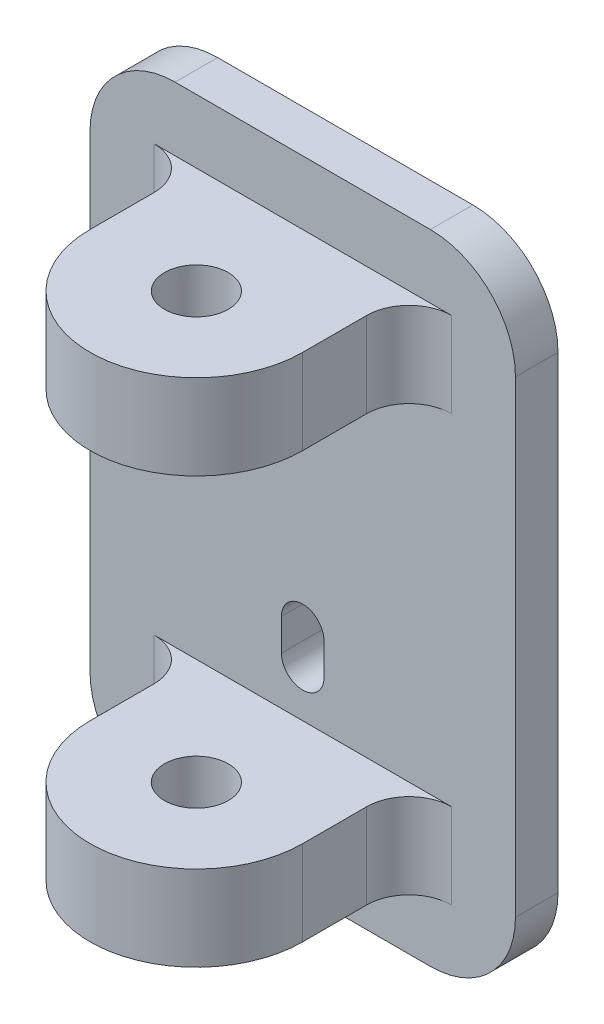
ISO-10303-21;
HEADER;
FILE_DESCRIPTION(('STEP AP214'),'2;1');
FILE_NAME('part.step','',(''),(''),'','','');
FILE_SCHEMA(('AUTOMOTIVE_DESIGN { 1 0 10303 214 1 1 1 1 }'));
ENDSEC;
DATA;
#1=APPLICATION_CONTEXT('core data for automotive mechanical design processes');
#2=APPLICATION_PROTOCOL_DEFINITION('international standard','automotive_design',2000,#1);
#3=PRODUCT_CONTEXT('',#1,'mechanical');
#4=PRODUCT('Part','Part','',(#3));
#5=PRODUCT_RELATED_PRODUCT_CATEGORY('part','',(#4));
#6=PRODUCT_DEFINITION_FORMATION('','',#4);
#7=PRODUCT_DEFINITION_CONTEXT('part definition',#1,'design');
#8=PRODUCT_DEFINITION('design','',#6,#7);
#9=PRODUCT_DEFINITION_SHAPE('','',#8);
#10=(LENGTH_UNIT() NAMED_UNIT(*) SI_UNIT(.MILLI.,.METRE.));
#11=(NAMED_UNIT(*) PLANE_ANGLE_UNIT() SI_UNIT($,.RADIAN.));
#12=(NAMED_UNIT(*) SI_UNIT($,.STERADIAN.) SOLID_ANGLE_UNIT());
#13=UNCERTAINTY_MEASURE_WITH_UNIT(LENGTH_MEASURE(1.E-05),#10,'distance_accuracy_value','');
#14=(GEOMETRIC_REPRESENTATION_CONTEXT(3) GLOBAL_UNCERTAINTY_ASSIGNED_CONTEXT((#13)) GLOBAL_UNIT_ASSIGNED_CONTEXT((#10,
#11,#12)) REPRESENTATION_CONTEXT('',''));
#15=CARTESIAN_POINT('',(0.,0.,0.));
#16=DIRECTION('',(0.,0.,1.));
#17=DIRECTION('',(1.,0.,0.));
#18=AXIS2_PLACEMENT_3D('',#15,#16,#17);
#19=CARTESIAN_POINT('',(74.4315889650291,-15.0719717401619,15.24));
#20=DIRECTION('',(0.,1.,0.));
#21=DIRECTION('',(-1.,0.,0.));
#22=AXIS2_PLACEMENT_3D('',#19,#20,#21);
#23=PLANE('',#22);
#24=CARTESIAN_POINT('',(80.7815889650291,-15.0719717401619,8.89000000000001));
#25=DIRECTION('',(0.,1.,0.));
#26=DIRECTION('',(-1.,0.,0.));
#27=AXIS2_PLACEMENT_3D('',#24,#25,#26);
#28=CIRCLE('',#27,1.90500000000001);
#29=CARTESIAN_POINT('',(78.8765889650291,-15.0719717401619,8.89000000000001));
#30=VERTEX_POINT('',#29);
#31=EDGE_CURVE('E268',#30,#30,#28,.T.);
#32=ORIENTED_EDGE('',*,*,#31,.T.);
#33=EDGE_LOOP('',(#32));
#34=FACE_BOUND('',#33,.T.);
#35=DIRECTION('',(0.,0.,-1.));
#36=VECTOR('',#35,1.);
#37=CARTESIAN_POINT('',(87.131588965029,-15.0719717401619,15.24));
#38=LINE('',#37,#36);
#39=CARTESIAN_POINT('',(87.131588965029,-15.0719717401619,8.89));
#40=VERTEX_POINT('',#39);
#41=CARTESIAN_POINT('',(87.131588965029,-15.0719717401619,5.08));
#42=VERTEX_POINT('',#41);
#43=EDGE_CURVE('E311',#40,#42,#38,.T.);
#44=ORIENTED_EDGE('',*,*,#43,.F.);
#45=CARTESIAN_POINT('',(80.7815889650291,-15.0719717401619,8.89000000000001));
#46=DIRECTION('',(0.,1.,0.));
#47=DIRECTION('',(-1.,0.,0.));
#48=AXIS2_PLACEMENT_3D('',#45,#46,#47);
#49=CIRCLE('',#48,6.34999999999999);
#50=CARTESIAN_POINT('',(74.4315889650291,-15.0719717401619,8.89000000000001));
#51=VERTEX_POINT('',#50);
#52=EDGE_CURVE('E284',#51,#40,#49,.T.);
#53=ORIENTED_EDGE('',*,*,#52,.F.);
#54=DIRECTION('',(0.,0.,-1.));
#55=VECTOR('',#54,1.);
#56=CARTESIAN_POINT('',(74.4315889650291,-15.0719717401619,15.24));
#57=LINE('',#56,#55);
#58=CARTESIAN_POINT('',(74.4315889650291,-15.0719717401619,5.08));
#59=VERTEX_POINT('',#58);
#60=EDGE_CURVE('E314',#51,#59,#57,.T.);
#61=ORIENTED_EDGE('',*,*,#60,.T.);
#62=CARTESIAN_POINT('',(71.891588965029,-15.0719717401619,5.08));
#63=DIRECTION('',(0.,1.,0.));
#64=DIRECTION('',(-1.,0.,0.));
#65=AXIS2_PLACEMENT_3D('',#62,#63,#64);
#66=CIRCLE('',#65,2.54);
#67=CARTESIAN_POINT('',(71.891588965029,-15.0719717401619,2.54));
#68=VERTEX_POINT('',#67);
#69=EDGE_CURVE('E59',#59,#68,#66,.T.);
#70=ORIENTED_EDGE('',*,*,#69,.T.);
#71=DIRECTION('',(1.,0.,0.));
#72=VECTOR('',#71,1.);
#73=CARTESIAN_POINT('',(74.4315889650291,-15.0719717401619,2.54));
#74=LINE('',#73,#72);
#75=CARTESIAN_POINT('',(89.671588965029,-15.0719717401619,2.54));
#76=VERTEX_POINT('',#75);
#77=EDGE_CURVE('E302',#68,#76,#74,.T.);
#78=ORIENTED_EDGE('',*,*,#77,.T.);
#79=CARTESIAN_POINT('',(89.671588965029,-15.0719717401619,5.08));
#80=DIRECTION('',(0.,1.,0.));
#81=DIRECTION('',(-1.,0.,0.));
#82=AXIS2_PLACEMENT_3D('',#79,#80,#81);
#83=CIRCLE('',#82,2.54);
#84=EDGE_CURVE('E406',#76,#42,#83,.T.);
#85=ORIENTED_EDGE('',*,*,#84,.T.);
#86=EDGE_LOOP('',(#44,#53,#61,#70,#78,#85));
#87=FACE_BOUND('',#86,.T.);
#88=ADVANCED_FACE('F51',(#34,#87),#23,.F.);
#89=CARTESIAN_POINT('',(74.431588965029,-9.9919717401619,15.24));
#90=DIRECTION('',(0.,-1.,0.));
#91=DIRECTION('',(1.,0.,0.));
#92=AXIS2_PLACEMENT_3D('',#89,#90,#91);
#93=PLANE('',#92);
#94=CARTESIAN_POINT('',(80.7815889650291,-9.9919717401619,8.89000000000001));
#95=DIRECTION('',(0.,-1.,0.));
#96=DIRECTION('',(1.,0.,0.));
#97=AXIS2_PLACEMENT_3D('',#94,#95,#96);
#98=CIRCLE('',#97,1.90500000000001);
#99=CARTESIAN_POINT('',(82.6865889650291,-9.9919717401619,8.89000000000001));
#100=VERTEX_POINT('',#99);
#101=EDGE_CURVE('E265',#100,#100,#98,.T.);
#102=ORIENTED_EDGE('',*,*,#101,.T.);
#103=EDGE_LOOP('',(#102));
#104=FACE_BOUND('',#103,.T.);
#105=CARTESIAN_POINT('',(80.7815889650291,-9.9919717401619,8.89000000000001));
#106=DIRECTION('',(0.,-1.,0.));
#107=DIRECTION('',(1.,0.,0.));
#108=AXIS2_PLACEMENT_3D('',#105,#106,#107);
#109=CIRCLE('',#108,6.34999999999999);
#110=CARTESIAN_POINT('',(87.131588965029,-9.9919717401619,8.89));
#111=VERTEX_POINT('',#110);
#112=CARTESIAN_POINT('',(74.4315889650291,-9.9919717401619,8.89000000000001));
#113=VERTEX_POINT('',#112);
#114=EDGE_CURVE('E282',#111,#113,#109,.T.);
#115=ORIENTED_EDGE('',*,*,#114,.F.);
#116=DIRECTION('',(0.,0.,-1.));
#117=VECTOR('',#116,1.);
#118=CARTESIAN_POINT('',(87.131588965029,-9.9919717401619,15.24));
#119=LINE('',#118,#117);
#120=CARTESIAN_POINT('',(87.131588965029,-9.9919717401619,5.08));
#121=VERTEX_POINT('',#120);
#122=EDGE_CURVE('E308',#111,#121,#119,.T.);
#123=ORIENTED_EDGE('',*,*,#122,.T.);
#124=CARTESIAN_POINT('',(89.671588965029,-9.9919717401619,5.08));
#125=DIRECTION('',(0.,-1.,0.));
#126=DIRECTION('',(1.,0.,0.));
#127=AXIS2_PLACEMENT_3D('',#124,#125,#126);
#128=CIRCLE('',#127,2.54);
#129=CARTESIAN_POINT('',(89.671588965029,-9.9919717401619,2.54));
#130=VERTEX_POINT('',#129);
#131=EDGE_CURVE('E403',#121,#130,#128,.T.);
#132=ORIENTED_EDGE('',*,*,#131,.T.);
#133=DIRECTION('',(-1.,0.,0.));
#134=VECTOR('',#133,1.);
#135=CARTESIAN_POINT('',(74.431588965029,-9.9919717401619,2.54));
#136=LINE('',#135,#134);
#137=CARTESIAN_POINT('',(71.891588965029,-9.9919717401619,2.54));
#138=VERTEX_POINT('',#137);
#139=EDGE_CURVE('E304',#130,#138,#136,.T.);
#140=ORIENTED_EDGE('',*,*,#139,.T.);
#141=CARTESIAN_POINT('',(71.891588965029,-9.9919717401619,5.08));
#142=DIRECTION('',(0.,-1.,0.));
#143=DIRECTION('',(1.,0.,0.));
#144=AXIS2_PLACEMENT_3D('',#141,#142,#143);
#145=CIRCLE('',#144,2.54);
#146=CARTESIAN_POINT('',(74.431588965029,-9.9919717401619,5.08));
#147=VERTEX_POINT('',#146);
#148=EDGE_CURVE('E12',#138,#147,#145,.T.);
#149=ORIENTED_EDGE('',*,*,#148,.T.);
#150=DIRECTION('',(0.,0.,-1.));
#151=VECTOR('',#150,1.);
#152=CARTESIAN_POINT('',(74.431588965029,-9.9919717401619,15.24));
#153=LINE('',#152,#151);
#154=EDGE_CURVE('E306',#113,#147,#153,.T.);
#155=ORIENTED_EDGE('',*,*,#154,.F.);
#156=EDGE_LOOP('',(#115,#123,#132,#140,#149,#155));
#157=FACE_BOUND('',#156,.T.);
#158=ADVANCED_FACE('F438',(#104,#157),#93,.F.);
#159=CARTESIAN_POINT('',(74.4315889650291,-40.4719717401619,15.24));
#160=DIRECTION('',(0.,1.,0.));
#161=DIRECTION('',(0.,0.,1.));
#162=AXIS2_PLACEMENT_3D('',#159,#160,#161);
#163=PLANE('',#162);
#164=CARTESIAN_POINT('',(80.781588965029,-40.471971740162,8.89000000000001));
#165=DIRECTION('',(0.,-1.,0.));
#166=DIRECTION('',(1.,0.,0.));
#167=AXIS2_PLACEMENT_3D('',#164,#165,#166);
#168=CIRCLE('',#167,1.90500000000001);
#169=CARTESIAN_POINT('',(82.686588965029,-40.471971740162,8.89000000000001));
#170=VERTEX_POINT('',#169);
#171=EDGE_CURVE('E259',#170,#170,#168,.T.);
#172=ORIENTED_EDGE('',*,*,#171,.F.);
#173=EDGE_LOOP('',(#172));
#174=FACE_BOUND('',#173,.T.);
#175=DIRECTION('',(0.,0.,-1.));
#176=VECTOR('',#175,1.);
#177=CARTESIAN_POINT('',(87.131588965029,-40.4719717401619,15.24));
#178=LINE('',#177,#176);
#179=CARTESIAN_POINT('',(87.131588965029,-40.471971740162,8.89));
#180=VERTEX_POINT('',#179);
#181=CARTESIAN_POINT('',(87.131588965029,-40.4719717401619,5.08));
#182=VERTEX_POINT('',#181);
#183=EDGE_CURVE('E299',#180,#182,#178,.T.);
#184=ORIENTED_EDGE('',*,*,#183,.F.);
#185=CARTESIAN_POINT('',(80.781588965029,-40.471971740162,8.89000000000001));
#186=DIRECTION('',(0.,-1.,0.));
#187=DIRECTION('',(1.,0.,0.));
#188=AXIS2_PLACEMENT_3D('',#185,#186,#187);
#189=CIRCLE('',#188,6.34999999999999);
#190=CARTESIAN_POINT('',(74.4315889650291,-40.4719717401619,8.89000000000001));
#191=VERTEX_POINT('',#190);
#192=EDGE_CURVE('E274',#180,#191,#189,.T.);
#193=ORIENTED_EDGE('',*,*,#192,.T.);
#194=DIRECTION('',(0.,0.,-1.));
#195=VECTOR('',#194,1.);
#196=CARTESIAN_POINT('',(74.4315889650291,-40.4719717401619,15.24));
#197=LINE('',#196,#195);
#198=CARTESIAN_POINT('',(74.4315889650291,-40.4719717401619,5.08));
#199=VERTEX_POINT('',#198);
#200=EDGE_CURVE('E290',#191,#199,#197,.T.);
#201=ORIENTED_EDGE('',*,*,#200,.T.);
#202=CARTESIAN_POINT('',(71.891588965029,-40.4719717401619,5.08));
#203=DIRECTION('',(0.,1.,0.));
#204=DIRECTION('',(0.,0.,1.));
#205=AXIS2_PLACEMENT_3D('',#202,#203,#204);
#206=CIRCLE('',#205,2.54);
#207=CARTESIAN_POINT('',(71.891588965029,-40.4719717401619,2.54));
#208=VERTEX_POINT('',#207);
#209=EDGE_CURVE('E413',#199,#208,#206,.T.);
#210=ORIENTED_EDGE('',*,*,#209,.T.);
#211=DIRECTION('',(1.,0.,0.));
#212=VECTOR('',#211,1.);
#213=CARTESIAN_POINT('',(74.4315889650291,-40.4719717401619,2.54));
#214=LINE('',#213,#212);
#215=CARTESIAN_POINT('',(89.671588965029,-40.4719717401619,2.54));
#216=VERTEX_POINT('',#215);
#217=EDGE_CURVE('E286',#208,#216,#214,.T.);
#218=ORIENTED_EDGE('',*,*,#217,.T.);
#219=CARTESIAN_POINT('',(89.671588965029,-40.4719717401619,5.08));
#220=DIRECTION('',(0.,1.,0.));
#221=DIRECTION('',(0.,0.,1.));
#222=AXIS2_PLACEMENT_3D('',#219,#220,#221);
#223=CIRCLE('',#222,2.54);
#224=EDGE_CURVE('E411',#216,#182,#223,.T.);
#225=ORIENTED_EDGE('',*,*,#224,.T.);
#226=EDGE_LOOP('',(#184,#193,#201,#210,#218,#225));
#227=FACE_BOUND('',#226,.T.);
#228=ADVANCED_FACE('F440',(#174,#227),#163,.F.);
#229=CARTESIAN_POINT('',(74.4315889650291,-35.3919717401619,15.24));
#230=DIRECTION('',(0.,-1.,0.));
#231=DIRECTION('',(0.,0.,-1.));
#232=AXIS2_PLACEMENT_3D('',#229,#230,#231);
#233=PLANE('',#232);
#234=CARTESIAN_POINT('',(80.781588965029,-35.3919717401619,8.89000000000001));
#235=DIRECTION('',(0.,-1.,0.));
#236=DIRECTION('',(0.,0.,-1.));
#237=AXIS2_PLACEMENT_3D('',#234,#235,#236);
#238=CIRCLE('',#237,1.90500000000001);
#239=CARTESIAN_POINT('',(80.781588965029,-35.3919717401619,6.985));
#240=VERTEX_POINT('',#239);
#241=EDGE_CURVE('E264',#240,#240,#238,.T.);
#242=ORIENTED_EDGE('',*,*,#241,.T.);
#243=EDGE_LOOP('',(#242));
#244=FACE_BOUND('',#243,.T.);
#245=CARTESIAN_POINT('',(80.781588965029,-35.3919717401619,8.89000000000001));
#246=DIRECTION('',(0.,-1.,0.));
#247=DIRECTION('',(0.,0.,-1.));
#248=AXIS2_PLACEMENT_3D('',#245,#246,#247);
#249=CIRCLE('',#248,6.34999999999999);
#250=CARTESIAN_POINT('',(87.131588965029,-35.3919717401619,8.89));
#251=VERTEX_POINT('',#250);
#252=CARTESIAN_POINT('',(74.4315889650291,-35.3919717401619,8.89000000000001));
#253=VERTEX_POINT('',#252);
#254=EDGE_CURVE('E280',#251,#253,#249,.T.);
#255=ORIENTED_EDGE('',*,*,#254,.F.);
#256=DIRECTION('',(0.,0.,-1.));
#257=VECTOR('',#256,1.);
#258=CARTESIAN_POINT('',(87.131588965029,-35.3919717401619,15.24));
#259=LINE('',#258,#257);
#260=CARTESIAN_POINT('',(87.131588965029,-35.3919717401619,5.08));
#261=VERTEX_POINT('',#260);
#262=EDGE_CURVE('E296',#251,#261,#259,.T.);
#263=ORIENTED_EDGE('',*,*,#262,.T.);
#264=CARTESIAN_POINT('',(89.671588965029,-35.3919717401619,5.08));
#265=DIRECTION('',(0.,-1.,0.));
#266=DIRECTION('',(0.,0.,-1.));
#267=AXIS2_PLACEMENT_3D('',#264,#265,#266);
#268=CIRCLE('',#267,2.54);
#269=CARTESIAN_POINT('',(89.671588965029,-35.3919717401619,2.54));
#270=VERTEX_POINT('',#269);
#271=EDGE_CURVE('E408',#261,#270,#268,.T.);
#272=ORIENTED_EDGE('',*,*,#271,.T.);
#273=DIRECTION('',(-1.,0.,0.));
#274=VECTOR('',#273,1.);
#275=CARTESIAN_POINT('',(74.4315889650291,-35.3919717401619,2.54));
#276=LINE('',#275,#274);
#277=CARTESIAN_POINT('',(71.891588965029,-35.3919717401619,2.54));
#278=VERTEX_POINT('',#277);
#279=EDGE_CURVE('E288',#270,#278,#276,.T.);
#280=ORIENTED_EDGE('',*,*,#279,.T.);
#281=CARTESIAN_POINT('',(71.891588965029,-35.3919717401619,5.08));
#282=DIRECTION('',(0.,-1.,0.));
#283=DIRECTION('',(0.,0.,-1.));
#284=AXIS2_PLACEMENT_3D('',#281,#282,#283);
#285=CIRCLE('',#284,2.54);
#286=CARTESIAN_POINT('',(74.4315889650291,-35.3919717401619,5.08));
#287=VERTEX_POINT('',#286);
#288=EDGE_CURVE('E416',#278,#287,#285,.T.);
#289=ORIENTED_EDGE('',*,*,#288,.T.);
#290=DIRECTION('',(0.,0.,-1.));
#291=VECTOR('',#290,1.);
#292=CARTESIAN_POINT('',(74.4315889650291,-35.3919717401619,15.24));
#293=LINE('',#292,#291);
#294=EDGE_CURVE('E293',#253,#287,#293,.T.);
#295=ORIENTED_EDGE('',*,*,#294,.F.);
#296=EDGE_LOOP('',(#255,#263,#272,#280,#289,#295));
#297=FACE_BOUND('',#296,.T.);
#298=ADVANCED_FACE('F447',(#244,#297),#233,.F.);
#299=CARTESIAN_POINT('',(74.431588965029,-9.9919717401619,15.24));
#300=DIRECTION('',(1.,0.,0.));
#301=DIRECTION('',(0.,1.,0.));
#302=AXIS2_PLACEMENT_3D('',#299,#300,#301);
#303=PLANE('',#302);
#304=ORIENTED_EDGE('',*,*,#154,.T.);
#305=DIRECTION('',(0.,-1.,0.));
#306=VECTOR('',#305,1.);
#307=CARTESIAN_POINT('',(74.431588965029,-9.9919717401619,5.08));
#308=LINE('',#307,#306);
#309=EDGE_CURVE('E401',#147,#59,#308,.T.);
#310=ORIENTED_EDGE('',*,*,#309,.T.);
#311=ORIENTED_EDGE('',*,*,#60,.F.);
#312=DIRECTION('',(0.,-1.,0.));
#313=VECTOR('',#312,1.);
#314=CARTESIAN_POINT('',(74.4315889650291,-6.18197174016189,8.89000000000001));
#315=LINE('',#314,#313);
#316=EDGE_CURVE('E279',#113,#51,#315,.T.);
#317=ORIENTED_EDGE('',*,*,#316,.F.);
#318=EDGE_LOOP('',(#304,#310,#311,#317));
#319=FACE_BOUND('',#318,.T.);
#320=ADVANCED_FACE('F437',(#319),#303,.F.);
#321=CARTESIAN_POINT('',(74.4315889650291,-40.4719717401619,15.24));
#322=DIRECTION('',(1.,0.,0.));
#323=DIRECTION('',(0.,0.,-1.));
#324=AXIS2_PLACEMENT_3D('',#321,#322,#323);
#325=PLANE('',#324);
#326=ORIENTED_EDGE('',*,*,#294,.T.);
#327=DIRECTION('',(0.,-1.,0.));
#328=VECTOR('',#327,1.);
#329=CARTESIAN_POINT('',(74.4315889650291,-40.4719717401619,5.08));
#330=LINE('',#329,#328);
#331=EDGE_CURVE('E398',#287,#199,#330,.T.);
#332=ORIENTED_EDGE('',*,*,#331,.T.);
#333=ORIENTED_EDGE('',*,*,#200,.F.);
#334=EDGE_CURVE('E277',#253,#191,#315,.T.);
#335=ORIENTED_EDGE('',*,*,#334,.F.);
#336=EDGE_LOOP('',(#326,#332,#333,#335));
#337=FACE_BOUND('',#336,.T.);
#338=ADVANCED_FACE('F459',(#337),#325,.F.);
#339=CARTESIAN_POINT('',(88.401588965029,-39.2019717401619,2.54));
#340=DIRECTION('',(0.,0.,1.));
#341=DIRECTION('',(1.,0.,0.));
#342=AXIS2_PLACEMENT_3D('',#339,#340,#341);
#343=PLANE('',#342);
#344=CARTESIAN_POINT('',(80.781588965029,-32.5344717401619,2.54));
#345=DIRECTION('',(0.,0.,1.));
#346=DIRECTION('',(1.,0.,0.));
#347=AXIS2_PLACEMENT_3D('',#344,#345,#346);
#348=CIRCLE('',#347,1.26999999999998);
#349=CARTESIAN_POINT('',(79.511588965029,-32.5344717401619,2.54));
#350=VERTEX_POINT('',#349);
#351=CARTESIAN_POINT('',(82.051588965029,-32.5344717401619,2.54));
#352=VERTEX_POINT('',#351);
#353=EDGE_CURVE('E219',#350,#352,#348,.T.);
#354=ORIENTED_EDGE('',*,*,#353,.F.);
#355=DIRECTION('',(0.,-1.,0.));
#356=VECTOR('',#355,1.);
#357=CARTESIAN_POINT('',(79.511588965029,-32.5344717401619,2.54));
#358=LINE('',#357,#356);
#359=CARTESIAN_POINT('',(79.511588965029,-30.6294717401619,2.54));
#360=VERTEX_POINT('',#359);
#361=EDGE_CURVE('E237',#360,#350,#358,.T.);
#362=ORIENTED_EDGE('',*,*,#361,.F.);
#363=CARTESIAN_POINT('',(80.781588965029,-30.6294717401619,2.54));
#364=DIRECTION('',(0.,0.,1.));
#365=DIRECTION('',(1.,0.,0.));
#366=AXIS2_PLACEMENT_3D('',#363,#364,#365);
#367=CIRCLE('',#366,1.26999999999998);
#368=CARTESIAN_POINT('',(82.051588965029,-30.6294717401619,2.54));
#369=VERTEX_POINT('',#368);
#370=EDGE_CURVE('E240',#369,#360,#367,.T.);
#371=ORIENTED_EDGE('',*,*,#370,.F.);
#372=DIRECTION('',(0.,1.,0.));
#373=VECTOR('',#372,1.);
#374=CARTESIAN_POINT('',(82.051588965029,-32.5344717401619,2.54));
#375=LINE('',#374,#373);
#376=EDGE_CURVE('E246',#352,#369,#375,.T.);
#377=ORIENTED_EDGE('',*,*,#376,.F.);
#378=EDGE_LOOP('',(#354,#362,#371,#377));
#379=FACE_BOUND('',#378,.T.);
#380=CARTESIAN_POINT('',(80.781588965029,-18.8819717401619,2.54));
#381=DIRECTION('',(0.,0.,1.));
#382=DIRECTION('',(1.,0.,0.));
#383=AXIS2_PLACEMENT_3D('',#380,#381,#382);
#384=CIRCLE('',#383,1.26999999999999);
#385=CARTESIAN_POINT('',(82.051588965029,-18.8819717401619,2.54));
#386=VERTEX_POINT('',#385);
#387=EDGE_CURVE('E252',#386,#386,#384,.T.);
#388=ORIENTED_EDGE('',*,*,#387,.F.);
#389=EDGE_LOOP('',(#388));
#390=FACE_BOUND('',#389,.T.);
#391=ORIENTED_EDGE('',*,*,#139,.F.);
#392=DIRECTION('',(0.,1.,0.));
#393=VECTOR('',#392,1.);
#394=CARTESIAN_POINT('',(89.6715889650289,-39.2019717401619,2.54));
#395=LINE('',#394,#393);
#396=EDGE_CURVE('E392',#130,#76,#395,.F.);
#397=ORIENTED_EDGE('',*,*,#396,.T.);
#398=ORIENTED_EDGE('',*,*,#77,.F.);
#399=DIRECTION('',(0.,-1.,0.));
#400=VECTOR('',#399,1.);
#401=CARTESIAN_POINT('',(71.8915889650291,-39.2019717401619,2.54));
#402=LINE('',#401,#400);
#403=EDGE_CURVE('E383',#68,#138,#402,.F.);
#404=ORIENTED_EDGE('',*,*,#403,.T.);
#405=EDGE_LOOP('',(#391,#397,#398,#404));
#406=FACE_BOUND('',#405,.T.);
#407=CARTESIAN_POINT('',(88.401588965029,-39.2019717401619,2.54));
#408=DIRECTION('',(0.,0.,1.));
#409=DIRECTION('',(1.,0.,0.));
#410=AXIS2_PLACEMENT_3D('',#407,#408,#409);
#411=CIRCLE('',#410,5.08);
#412=CARTESIAN_POINT('',(88.401588965029,-44.2819717401619,2.54));
#413=VERTEX_POINT('',#412);
#414=CARTESIAN_POINT('',(93.481588965029,-39.2019717401619,2.54));
#415=VERTEX_POINT('',#414);
#416=EDGE_CURVE('E318',#413,#415,#411,.T.);
#417=ORIENTED_EDGE('',*,*,#416,.T.);
#418=DIRECTION('',(0.,1.,0.));
#419=VECTOR('',#418,1.);
#420=CARTESIAN_POINT('',(93.481588965029,-11.2619717401619,2.54));
#421=LINE('',#420,#419);
#422=CARTESIAN_POINT('',(93.481588965029,-11.2619717401619,2.54));
#423=VERTEX_POINT('',#422);
#424=EDGE_CURVE('E321',#415,#423,#421,.T.);
#425=ORIENTED_EDGE('',*,*,#424,.T.);
#426=CARTESIAN_POINT('',(88.401588965029,-11.2619717401619,2.54));
#427=DIRECTION('',(0.,0.,1.));
#428=DIRECTION('',(-1.,0.,0.));
#429=AXIS2_PLACEMENT_3D('',#426,#427,#428);
#430=CIRCLE('',#429,5.08);
#431=CARTESIAN_POINT('',(88.401588965029,-6.1819717401619,2.54));
#432=VERTEX_POINT('',#431);
#433=EDGE_CURVE('E324',#423,#432,#430,.T.);
#434=ORIENTED_EDGE('',*,*,#433,.T.);
#435=DIRECTION('',(-1.,0.,0.));
#436=VECTOR('',#435,1.);
#437=CARTESIAN_POINT('',(73.1615889650291,-6.1819717401619,2.54));
#438=LINE('',#437,#436);
#439=CARTESIAN_POINT('',(73.1615889650291,-6.1819717401619,2.54));
#440=VERTEX_POINT('',#439);
#441=EDGE_CURVE('E326',#432,#440,#438,.T.);
#442=ORIENTED_EDGE('',*,*,#441,.T.);
#443=CARTESIAN_POINT('',(73.161588965029,-11.2619717401619,2.54));
#444=DIRECTION('',(0.,0.,1.));
#445=DIRECTION('',(1.,0.,0.));
#446=AXIS2_PLACEMENT_3D('',#443,#444,#445);
#447=CIRCLE('',#446,5.08);
#448=CARTESIAN_POINT('',(68.081588965029,-11.2619717401619,2.54));
#449=VERTEX_POINT('',#448);
#450=EDGE_CURVE('E328',#440,#449,#447,.T.);
#451=ORIENTED_EDGE('',*,*,#450,.T.);
#452=DIRECTION('',(0.,-1.,0.));
#453=VECTOR('',#452,1.);
#454=CARTESIAN_POINT('',(68.081588965029,-11.2619717401619,2.54));
#455=LINE('',#454,#453);
#456=CARTESIAN_POINT('',(68.081588965029,-39.2019717401619,2.54));
#457=VERTEX_POINT('',#456);
#458=EDGE_CURVE('E330',#449,#457,#455,.T.);
#459=ORIENTED_EDGE('',*,*,#458,.T.);
#460=CARTESIAN_POINT('',(73.161588965029,-39.2019717401619,2.54));
#461=DIRECTION('',(0.,0.,1.));
#462=DIRECTION('',(1.,0.,0.));
#463=AXIS2_PLACEMENT_3D('',#460,#461,#462);
#464=CIRCLE('',#463,5.08);
#465=CARTESIAN_POINT('',(73.1615889650291,-44.2819717401619,2.54));
#466=VERTEX_POINT('',#465);
#467=EDGE_CURVE('E332',#457,#466,#464,.T.);
#468=ORIENTED_EDGE('',*,*,#467,.T.);
#469=DIRECTION('',(1.,0.,0.));
#470=VECTOR('',#469,1.);
#471=CARTESIAN_POINT('',(73.1615889650291,-44.2819717401619,2.54));
#472=LINE('',#471,#470);
#473=EDGE_CURVE('E334',#466,#413,#472,.T.);
#474=ORIENTED_EDGE('',*,*,#473,.T.);
#475=EDGE_LOOP('',(#417,#425,#434,#442,#451,#459,#468,#474));
#476=FACE_BOUND('',#475,.T.);
#477=ORIENTED_EDGE('',*,*,#279,.F.);
#478=DIRECTION('',(0.,1.,0.));
#479=VECTOR('',#478,1.);
#480=CARTESIAN_POINT('',(89.671588965029,-39.2019717401619,2.54));
#481=LINE('',#480,#479);
#482=EDGE_CURVE('E389',#270,#216,#481,.F.);
#483=ORIENTED_EDGE('',*,*,#482,.T.);
#484=ORIENTED_EDGE('',*,*,#217,.F.);
#485=DIRECTION('',(0.,-1.,0.));
#486=VECTOR('',#485,1.);
#487=CARTESIAN_POINT('',(71.891588965029,-39.2019717401619,2.54));
#488=LINE('',#487,#486);
#489=EDGE_CURVE('E386',#208,#278,#488,.F.);
#490=ORIENTED_EDGE('',*,*,#489,.T.);
#491=EDGE_LOOP('',(#477,#483,#484,#490));
#492=FACE_BOUND('',#491,.T.);
#493=ADVANCED_FACE('F422',(#379,#390,#406,#476,#492),#343,.T.);
#494=CARTESIAN_POINT('',(88.401588965029,-39.2019717401619,2.54));
#495=DIRECTION('',(0.,0.,-1.));
#496=DIRECTION('',(-1.,0.,0.));
#497=AXIS2_PLACEMENT_3D('',#494,#495,#496);
#498=CYLINDRICAL_SURFACE('',#497,5.08);
#499=CARTESIAN_POINT('',(88.401588965029,-39.2019717401619,0.));
#500=DIRECTION('',(0.,0.,1.));
#501=DIRECTION('',(1.,0.,0.));
#502=AXIS2_PLACEMENT_3D('',#499,#500,#501);
#503=CIRCLE('',#502,5.08);
#504=CARTESIAN_POINT('',(88.401588965029,-44.2819717401619,0.));
#505=VERTEX_POINT('',#504);
#506=CARTESIAN_POINT('',(93.481588965029,-39.2019717401619,0.));
#507=VERTEX_POINT('',#506);
#508=EDGE_CURVE('E317',#505,#507,#503,.T.);
#509=ORIENTED_EDGE('',*,*,#508,.T.);
#510=DIRECTION('',(0.,0.,-1.));
#511=VECTOR('',#510,1.);
#512=CARTESIAN_POINT('',(93.481588965029,-39.2019717401619,2.54));
#513=LINE('',#512,#511);
#514=EDGE_CURVE('E372',#415,#507,#513,.T.);
#515=ORIENTED_EDGE('',*,*,#514,.F.);
#516=ORIENTED_EDGE('',*,*,#416,.F.);
#517=DIRECTION('',(0.,0.,-1.));
#518=VECTOR('',#517,1.);
#519=CARTESIAN_POINT('',(88.401588965029,-44.2819717401619,2.54));
#520=LINE('',#519,#518);
#521=EDGE_CURVE('E336',#413,#505,#520,.T.);
#522=ORIENTED_EDGE('',*,*,#521,.T.);
#523=EDGE_LOOP('',(#509,#515,#516,#522));
#524=FACE_BOUND('',#523,.T.);
#525=ADVANCED_FACE('F462',(#524),#498,.T.);
#526=CARTESIAN_POINT('',(93.481588965029,-11.2619717401619,2.54));
#527=DIRECTION('',(-1.,0.,0.));
#528=DIRECTION('',(0.,0.,1.));
#529=AXIS2_PLACEMENT_3D('',#526,#527,#528);
#530=PLANE('',#529);
#531=DIRECTION('',(0.,1.,0.));
#532=VECTOR('',#531,1.);
#533=CARTESIAN_POINT('',(93.481588965029,-11.2619717401619,0.));
#534=LINE('',#533,#532);
#535=CARTESIAN_POINT('',(93.481588965029,-11.2619717401619,0.));
#536=VERTEX_POINT('',#535);
#537=EDGE_CURVE('E339',#507,#536,#534,.T.);
#538=ORIENTED_EDGE('',*,*,#537,.T.);
#539=DIRECTION('',(0.,0.,-1.));
#540=VECTOR('',#539,1.);
#541=CARTESIAN_POINT('',(93.481588965029,-11.2619717401619,2.54));
#542=LINE('',#541,#540);
#543=EDGE_CURVE('E369',#423,#536,#542,.T.);
#544=ORIENTED_EDGE('',*,*,#543,.F.);
#545=ORIENTED_EDGE('',*,*,#424,.F.);
#546=ORIENTED_EDGE('',*,*,#514,.T.);
#547=EDGE_LOOP('',(#538,#544,#545,#546));
#548=FACE_BOUND('',#547,.T.);
#549=ADVANCED_FACE('F489',(#548),#530,.F.);
#550=CARTESIAN_POINT('',(88.401588965029,-11.2619717401619,2.54));
#551=DIRECTION('',(0.,0.,-1.));
#552=DIRECTION('',(-1.,0.,0.));
#553=AXIS2_PLACEMENT_3D('',#550,#551,#552);
#554=CYLINDRICAL_SURFACE('',#553,5.08);
#555=CARTESIAN_POINT('',(88.401588965029,-11.2619717401619,0.));
#556=DIRECTION('',(0.,0.,1.));
#557=DIRECTION('',(-1.,0.,0.));
#558=AXIS2_PLACEMENT_3D('',#555,#556,#557);
#559=CIRCLE('',#558,5.08);
#560=CARTESIAN_POINT('',(88.401588965029,-6.1819717401619,0.));
#561=VERTEX_POINT('',#560);
#562=EDGE_CURVE('E341',#536,#561,#559,.T.);
#563=ORIENTED_EDGE('',*,*,#562,.T.);
#564=DIRECTION('',(0.,0.,-1.));
#565=VECTOR('',#564,1.);
#566=CARTESIAN_POINT('',(88.401588965029,-6.1819717401619,2.54));
#567=LINE('',#566,#565);
#568=EDGE_CURVE('E366',#432,#561,#567,.T.);
#569=ORIENTED_EDGE('',*,*,#568,.F.);
#570=ORIENTED_EDGE('',*,*,#433,.F.);
#571=ORIENTED_EDGE('',*,*,#543,.T.);
#572=EDGE_LOOP('',(#563,#569,#570,#571));
#573=FACE_BOUND('',#572,.T.);
#574=ADVANCED_FACE('F485',(#573),#554,.T.);
#575=CARTESIAN_POINT('',(73.1615889650291,-6.1819717401619,2.54));
#576=DIRECTION('',(0.,-1.,0.));
#577=DIRECTION('',(0.,0.,-1.));
#578=AXIS2_PLACEMENT_3D('',#575,#576,#577);
#579=PLANE('',#578);
#580=DIRECTION('',(-1.,0.,0.));
#581=VECTOR('',#580,1.);
#582=CARTESIAN_POINT('',(73.1615889650291,-6.1819717401619,0.));
#583=LINE('',#582,#581);
#584=CARTESIAN_POINT('',(73.1615889650291,-6.1819717401619,0.));
#585=VERTEX_POINT('',#584);
#586=EDGE_CURVE('E343',#561,#585,#583,.T.);
#587=ORIENTED_EDGE('',*,*,#586,.T.);
#588=DIRECTION('',(0.,0.,-1.));
#589=VECTOR('',#588,1.);
#590=CARTESIAN_POINT('',(73.1615889650291,-6.1819717401619,2.54));
#591=LINE('',#590,#589);
#592=EDGE_CURVE('E363',#440,#585,#591,.T.);
#593=ORIENTED_EDGE('',*,*,#592,.F.);
#594=ORIENTED_EDGE('',*,*,#441,.F.);
#595=ORIENTED_EDGE('',*,*,#568,.T.);
#596=EDGE_LOOP('',(#587,#593,#594,#595));
#597=FACE_BOUND('',#596,.T.);
#598=ADVANCED_FACE('F481',(#597),#579,.F.);
#599=CARTESIAN_POINT('',(73.161588965029,-11.2619717401619,2.54));
#600=DIRECTION('',(0.,0.,-1.));
#601=DIRECTION('',(-1.,0.,0.));
#602=AXIS2_PLACEMENT_3D('',#599,#600,#601);
#603=CYLINDRICAL_SURFACE('',#602,5.08);
#604=CARTESIAN_POINT('',(73.161588965029,-11.2619717401619,0.));
#605=DIRECTION('',(0.,0.,1.));
#606=DIRECTION('',(1.,0.,0.));
#607=AXIS2_PLACEMENT_3D('',#604,#605,#606);
#608=CIRCLE('',#607,5.08);
#609=CARTESIAN_POINT('',(68.081588965029,-11.2619717401619,0.));
#610=VERTEX_POINT('',#609);
#611=EDGE_CURVE('E345',#585,#610,#608,.T.);
#612=ORIENTED_EDGE('',*,*,#611,.T.);
#613=DIRECTION('',(0.,0.,-1.));
#614=VECTOR('',#613,1.);
#615=CARTESIAN_POINT('',(68.081588965029,-11.2619717401619,2.54));
#616=LINE('',#615,#614);
#617=EDGE_CURVE('E360',#449,#610,#616,.T.);
#618=ORIENTED_EDGE('',*,*,#617,.F.);
#619=ORIENTED_EDGE('',*,*,#450,.F.);
#620=ORIENTED_EDGE('',*,*,#592,.T.);
#621=EDGE_LOOP('',(#612,#618,#619,#620));
#622=FACE_BOUND('',#621,.T.);
#623=ADVANCED_FACE('F477',(#622),#603,.T.);
#624=CARTESIAN_POINT('',(68.081588965029,-11.2619717401619,2.54));
#625=DIRECTION('',(1.,0.,0.));
#626=DIRECTION('',(0.,0.,-1.));
#627=AXIS2_PLACEMENT_3D('',#624,#625,#626);
#628=PLANE('',#627);
#629=DIRECTION('',(0.,-1.,0.));
#630=VECTOR('',#629,1.);
#631=CARTESIAN_POINT('',(68.081588965029,-11.2619717401619,0.));
#632=LINE('',#631,#630);
#633=CARTESIAN_POINT('',(68.081588965029,-39.2019717401619,0.));
#634=VERTEX_POINT('',#633);
#635=EDGE_CURVE('E347',#610,#634,#632,.T.);
#636=ORIENTED_EDGE('',*,*,#635,.T.);
#637=DIRECTION('',(0.,0.,-1.));
#638=VECTOR('',#637,1.);
#639=CARTESIAN_POINT('',(68.081588965029,-39.2019717401619,2.54));
#640=LINE('',#639,#638);
#641=EDGE_CURVE('E357',#457,#634,#640,.T.);
#642=ORIENTED_EDGE('',*,*,#641,.F.);
#643=ORIENTED_EDGE('',*,*,#458,.F.);
#644=ORIENTED_EDGE('',*,*,#617,.T.);
#645=EDGE_LOOP('',(#636,#642,#643,#644));
#646=FACE_BOUND('',#645,.T.);
#647=ADVANCED_FACE('F473',(#646),#628,.F.);
#648=CARTESIAN_POINT('',(73.161588965029,-39.2019717401619,2.54));
#649=DIRECTION('',(0.,0.,-1.));
#650=DIRECTION('',(-1.,0.,0.));
#651=AXIS2_PLACEMENT_3D('',#648,#649,#650);
#652=CYLINDRICAL_SURFACE('',#651,5.08);
#653=CARTESIAN_POINT('',(73.161588965029,-39.2019717401619,0.));
#654=DIRECTION('',(0.,0.,1.));
#655=DIRECTION('',(1.,0.,0.));
#656=AXIS2_PLACEMENT_3D('',#653,#654,#655);
#657=CIRCLE('',#656,5.08);
#658=CARTESIAN_POINT('',(73.1615889650291,-44.2819717401619,0.));
#659=VERTEX_POINT('',#658);
#660=EDGE_CURVE('E349',#634,#659,#657,.T.);
#661=ORIENTED_EDGE('',*,*,#660,.T.);
#662=DIRECTION('',(0.,0.,-1.));
#663=VECTOR('',#662,1.);
#664=CARTESIAN_POINT('',(73.1615889650291,-44.2819717401619,2.54));
#665=LINE('',#664,#663);
#666=EDGE_CURVE('E354',#466,#659,#665,.T.);
#667=ORIENTED_EDGE('',*,*,#666,.F.);
#668=ORIENTED_EDGE('',*,*,#467,.F.);
#669=ORIENTED_EDGE('',*,*,#641,.T.);
#670=EDGE_LOOP('',(#661,#667,#668,#669));
#671=FACE_BOUND('',#670,.T.);
#672=ADVANCED_FACE('F469',(#671),#652,.T.);
#673=CARTESIAN_POINT('',(73.1615889650291,-44.2819717401619,2.54));
#674=DIRECTION('',(0.,1.,0.));
#675=DIRECTION('',(0.,0.,1.));
#676=AXIS2_PLACEMENT_3D('',#673,#674,#675);
#677=PLANE('',#676);
#678=DIRECTION('',(1.,0.,0.));
#679=VECTOR('',#678,1.);
#680=CARTESIAN_POINT('',(73.1615889650291,-44.2819717401619,0.));
#681=LINE('',#680,#679);
#682=EDGE_CURVE('E322',#659,#505,#681,.T.);
#683=ORIENTED_EDGE('',*,*,#682,.T.);
#684=ORIENTED_EDGE('',*,*,#521,.F.);
#685=ORIENTED_EDGE('',*,*,#473,.F.);
#686=ORIENTED_EDGE('',*,*,#666,.T.);
#687=EDGE_LOOP('',(#683,#684,#685,#686));
#688=FACE_BOUND('',#687,.T.);
#689=ADVANCED_FACE('F466',(#688),#677,.F.);
#690=CARTESIAN_POINT('',(88.401588965029,-39.2019717401619,0.));
#691=DIRECTION('',(0.,0.,1.));
#692=DIRECTION('',(1.,0.,0.));
#693=AXIS2_PLACEMENT_3D('',#690,#691,#692);
#694=PLANE('',#693);
#695=DIRECTION('',(0.,-1.,0.));
#696=VECTOR('',#695,1.);
#697=CARTESIAN_POINT('',(79.511588965029,-32.5344717401619,0.));
#698=LINE('',#697,#696);
#699=CARTESIAN_POINT('',(79.511588965029,-30.6294717401619,0.));
#700=VERTEX_POINT('',#699);
#701=CARTESIAN_POINT('',(79.511588965029,-32.5344717401619,0.));
#702=VERTEX_POINT('',#701);
#703=EDGE_CURVE('E224',#700,#702,#698,.T.);
#704=ORIENTED_EDGE('',*,*,#703,.T.);
#705=CARTESIAN_POINT('',(80.781588965029,-32.5344717401619,0.));
#706=DIRECTION('',(0.,0.,1.));
#707=DIRECTION('',(1.,0.,0.));
#708=AXIS2_PLACEMENT_3D('',#705,#706,#707);
#709=CIRCLE('',#708,1.26999999999998);
#710=CARTESIAN_POINT('',(82.051588965029,-32.5344717401619,0.));
#711=VERTEX_POINT('',#710);
#712=EDGE_CURVE('E216',#702,#711,#709,.T.);
#713=ORIENTED_EDGE('',*,*,#712,.T.);
#714=DIRECTION('',(0.,1.,0.));
#715=VECTOR('',#714,1.);
#716=CARTESIAN_POINT('',(82.051588965029,-32.5344717401619,0.));
#717=LINE('',#716,#715);
#718=CARTESIAN_POINT('',(82.051588965029,-30.6294717401619,0.));
#719=VERTEX_POINT('',#718);
#720=EDGE_CURVE('E228',#711,#719,#717,.T.);
#721=ORIENTED_EDGE('',*,*,#720,.T.);
#722=CARTESIAN_POINT('',(80.781588965029,-30.6294717401619,0.));
#723=DIRECTION('',(0.,0.,1.));
#724=DIRECTION('',(1.,0.,0.));
#725=AXIS2_PLACEMENT_3D('',#722,#723,#724);
#726=CIRCLE('',#725,1.26999999999998);
#727=EDGE_CURVE('E232',#719,#700,#726,.T.);
#728=ORIENTED_EDGE('',*,*,#727,.T.);
#729=EDGE_LOOP('',(#704,#713,#721,#728));
#730=FACE_BOUND('',#729,.T.);
#731=CARTESIAN_POINT('',(80.781588965029,-18.8819717401619,0.));
#732=DIRECTION('',(0.,0.,1.));
#733=DIRECTION('',(1.,0.,0.));
#734=AXIS2_PLACEMENT_3D('',#731,#732,#733);
#735=CIRCLE('',#734,1.26999999999999);
#736=CARTESIAN_POINT('',(82.051588965029,-18.8819717401619,0.));
#737=VERTEX_POINT('',#736);
#738=EDGE_CURVE('E256',#737,#737,#735,.T.);
#739=ORIENTED_EDGE('',*,*,#738,.T.);
#740=EDGE_LOOP('',(#739));
#741=FACE_BOUND('',#740,.T.);
#742=ORIENTED_EDGE('',*,*,#508,.F.);
#743=ORIENTED_EDGE('',*,*,#682,.F.);
#744=ORIENTED_EDGE('',*,*,#660,.F.);
#745=ORIENTED_EDGE('',*,*,#635,.F.);
#746=ORIENTED_EDGE('',*,*,#611,.F.);
#747=ORIENTED_EDGE('',*,*,#586,.F.);
#748=ORIENTED_EDGE('',*,*,#562,.F.);
#749=ORIENTED_EDGE('',*,*,#537,.F.);
#750=EDGE_LOOP('',(#742,#743,#744,#745,#746,#747,#748,#749));
#751=FACE_BOUND('',#750,.T.);
#752=ADVANCED_FACE('F234',(#730,#741,#751),#694,.F.);
#753=CARTESIAN_POINT('',(87.131588965029,-9.9919717401619,15.24));
#754=DIRECTION('',(-1.,0.,0.));
#755=DIRECTION('',(0.,-1.,0.));
#756=AXIS2_PLACEMENT_3D('',#753,#754,#755);
#757=PLANE('',#756);
#758=ORIENTED_EDGE('',*,*,#43,.T.);
#759=DIRECTION('',(0.,1.,0.));
#760=VECTOR('',#759,1.);
#761=CARTESIAN_POINT('',(87.131588965029,-9.9919717401619,5.08));
#762=LINE('',#761,#760);
#763=EDGE_CURVE('E378',#42,#121,#762,.T.);
#764=ORIENTED_EDGE('',*,*,#763,.T.);
#765=ORIENTED_EDGE('',*,*,#122,.F.);
#766=DIRECTION('',(0.,-1.,0.));
#767=VECTOR('',#766,1.);
#768=CARTESIAN_POINT('',(87.131588965029,-6.1819717401619,8.89));
#769=LINE('',#768,#767);
#770=EDGE_CURVE('E271',#111,#40,#769,.T.);
#771=ORIENTED_EDGE('',*,*,#770,.T.);
#772=EDGE_LOOP('',(#758,#764,#765,#771));
#773=FACE_BOUND('',#772,.T.);
#774=ADVANCED_FACE('F430',(#773),#757,.F.);
#775=CARTESIAN_POINT('',(87.131588965029,-40.4719717401619,15.24));
#776=DIRECTION('',(-1.,0.,0.));
#777=DIRECTION('',(0.,-1.,0.));
#778=AXIS2_PLACEMENT_3D('',#775,#776,#777);
#779=PLANE('',#778);
#780=ORIENTED_EDGE('',*,*,#183,.T.);
#781=DIRECTION('',(0.,1.,0.));
#782=VECTOR('',#781,1.);
#783=CARTESIAN_POINT('',(87.131588965029,-40.4719717401619,5.08));
#784=LINE('',#783,#782);
#785=EDGE_CURVE('E395',#182,#261,#784,.T.);
#786=ORIENTED_EDGE('',*,*,#785,.T.);
#787=ORIENTED_EDGE('',*,*,#262,.F.);
#788=DIRECTION('',(0.,-1.,0.));
#789=VECTOR('',#788,1.);
#790=CARTESIAN_POINT('',(87.131588965029,-6.18197174016188,8.89000000000001));
#791=LINE('',#790,#789);
#792=EDGE_CURVE('E375',#251,#180,#791,.T.);
#793=ORIENTED_EDGE('',*,*,#792,.T.);
#794=EDGE_LOOP('',(#780,#786,#787,#793));
#795=FACE_BOUND('',#794,.T.);
#796=ADVANCED_FACE('F455',(#795),#779,.F.);
#797=CARTESIAN_POINT('',(80.7815889650291,-6.1819717401619,8.89000000000001));
#798=DIRECTION('',(0.,-1.,0.));
#799=DIRECTION('',(1.,0.,0.));
#800=AXIS2_PLACEMENT_3D('',#797,#798,#799);
#801=CYLINDRICAL_SURFACE('',#800,6.34999999999999);
#802=ORIENTED_EDGE('',*,*,#254,.T.);
#803=ORIENTED_EDGE('',*,*,#334,.T.);
#804=ORIENTED_EDGE('',*,*,#192,.F.);
#805=ORIENTED_EDGE('',*,*,#792,.F.);
#806=EDGE_LOOP('',(#802,#803,#804,#805));
#807=FACE_BOUND('',#806,.T.);
#808=ADVANCED_FACE('F517',(#807),#801,.T.);
#809=ORIENTED_EDGE('',*,*,#52,.T.);
#810=ORIENTED_EDGE('',*,*,#770,.F.);
#811=ORIENTED_EDGE('',*,*,#114,.T.);
#812=ORIENTED_EDGE('',*,*,#316,.T.);
#813=EDGE_LOOP('',(#809,#810,#811,#812));
#814=FACE_BOUND('',#813,.T.);
#815=ADVANCED_FACE('F434',(#814),#801,.T.);
#816=CARTESIAN_POINT('',(80.7815889650291,-6.1819717401619,8.89000000000001));
#817=DIRECTION('',(0.,-1.,0.));
#818=DIRECTION('',(1.,0.,0.));
#819=AXIS2_PLACEMENT_3D('',#816,#817,#818);
#820=CYLINDRICAL_SURFACE('',#819,1.90500000000001);
#821=ORIENTED_EDGE('',*,*,#171,.T.);
#822=EDGE_LOOP('',(#821));
#823=FACE_BOUND('',#822,.T.);
#824=ORIENTED_EDGE('',*,*,#241,.F.);
#825=EDGE_LOOP('',(#824));
#826=FACE_BOUND('',#825,.T.);
#827=ADVANCED_FACE('F539',(#823,#826),#820,.F.);
#828=ORIENTED_EDGE('',*,*,#101,.F.);
#829=EDGE_LOOP('',(#828));
#830=FACE_BOUND('',#829,.T.);
#831=ORIENTED_EDGE('',*,*,#31,.F.);
#832=EDGE_LOOP('',(#831));
#833=FACE_BOUND('',#832,.T.);
#834=ADVANCED_FACE('F540',(#830,#833),#820,.F.);
#835=CARTESIAN_POINT('',(80.781588965029,-18.8819717401619,0.));
#836=DIRECTION('',(0.,0.,1.));
#837=DIRECTION('',(1.,0.,0.));
#838=AXIS2_PLACEMENT_3D('',#835,#836,#837);
#839=CYLINDRICAL_SURFACE('',#838,1.26999999999999);
#840=ORIENTED_EDGE('',*,*,#738,.F.);
#841=EDGE_LOOP('',(#840));
#842=FACE_BOUND('',#841,.T.);
#843=ORIENTED_EDGE('',*,*,#387,.T.);
#844=EDGE_LOOP('',(#843));
#845=FACE_BOUND('',#844,.T.);
#846=ADVANCED_FACE('F543',(#842,#845),#839,.F.);
#847=CARTESIAN_POINT('',(80.781588965029,-32.5344717401619,0.));
#848=DIRECTION('',(0.,0.,1.));
#849=DIRECTION('',(1.,0.,0.));
#850=AXIS2_PLACEMENT_3D('',#847,#848,#849);
#851=CYLINDRICAL_SURFACE('',#850,1.26999999999998);
#852=ORIENTED_EDGE('',*,*,#353,.T.);
#853=DIRECTION('',(0.,0.,1.));
#854=VECTOR('',#853,1.);
#855=CARTESIAN_POINT('',(82.051588965029,-32.5344717401619,0.));
#856=LINE('',#855,#854);
#857=EDGE_CURVE('E212',#711,#352,#856,.T.);
#858=ORIENTED_EDGE('',*,*,#857,.F.);
#859=ORIENTED_EDGE('',*,*,#712,.F.);
#860=DIRECTION('',(0.,0.,1.));
#861=VECTOR('',#860,1.);
#862=CARTESIAN_POINT('',(79.511588965029,-32.5344717401619,0.));
#863=LINE('',#862,#861);
#864=EDGE_CURVE('E250',#702,#350,#863,.T.);
#865=ORIENTED_EDGE('',*,*,#864,.T.);
#866=EDGE_LOOP('',(#852,#858,#859,#865));
#867=FACE_BOUND('',#866,.T.);
#868=ADVANCED_FACE('F214',(#867),#851,.F.);
#869=CARTESIAN_POINT('',(79.511588965029,-32.5344717401619,0.));
#870=DIRECTION('',(-1.,0.,0.));
#871=DIRECTION('',(0.,0.,1.));
#872=AXIS2_PLACEMENT_3D('',#869,#870,#871);
#873=PLANE('',#872);
#874=ORIENTED_EDGE('',*,*,#361,.T.);
#875=ORIENTED_EDGE('',*,*,#864,.F.);
#876=ORIENTED_EDGE('',*,*,#703,.F.);
#877=DIRECTION('',(0.,0.,1.));
#878=VECTOR('',#877,1.);
#879=CARTESIAN_POINT('',(79.511588965029,-30.6294717401619,0.));
#880=LINE('',#879,#878);
#881=EDGE_CURVE('E253',#700,#360,#880,.T.);
#882=ORIENTED_EDGE('',*,*,#881,.T.);
#883=EDGE_LOOP('',(#874,#875,#876,#882));
#884=FACE_BOUND('',#883,.T.);
#885=ADVANCED_FACE('F550',(#884),#873,.F.);
#886=CARTESIAN_POINT('',(80.781588965029,-30.6294717401619,0.));
#887=DIRECTION('',(0.,0.,1.));
#888=DIRECTION('',(1.,0.,0.));
#889=AXIS2_PLACEMENT_3D('',#886,#887,#888);
#890=CYLINDRICAL_SURFACE('',#889,1.26999999999998);
#891=ORIENTED_EDGE('',*,*,#370,.T.);
#892=ORIENTED_EDGE('',*,*,#881,.F.);
#893=ORIENTED_EDGE('',*,*,#727,.F.);
#894=DIRECTION('',(0.,0.,1.));
#895=VECTOR('',#894,1.);
#896=CARTESIAN_POINT('',(82.051588965029,-30.6294717401619,0.));
#897=LINE('',#896,#895);
#898=EDGE_CURVE('E223',#719,#369,#897,.T.);
#899=ORIENTED_EDGE('',*,*,#898,.T.);
#900=EDGE_LOOP('',(#891,#892,#893,#899));
#901=FACE_BOUND('',#900,.T.);
#902=ADVANCED_FACE('F553',(#901),#890,.F.);
#903=CARTESIAN_POINT('',(82.051588965029,-32.5344717401619,0.));
#904=DIRECTION('',(1.,0.,0.));
#905=DIRECTION('',(0.,0.,-1.));
#906=AXIS2_PLACEMENT_3D('',#903,#904,#905);
#907=PLANE('',#906);
#908=ORIENTED_EDGE('',*,*,#376,.T.);
#909=ORIENTED_EDGE('',*,*,#898,.F.);
#910=ORIENTED_EDGE('',*,*,#720,.F.);
#911=ORIENTED_EDGE('',*,*,#857,.T.);
#912=EDGE_LOOP('',(#908,#909,#910,#911));
#913=FACE_BOUND('',#912,.T.);
#914=ADVANCED_FACE('F229',(#913),#907,.F.);
#915=CARTESIAN_POINT('',(89.671588965029,-9.99197174016191,5.08));
#916=DIRECTION('',(0.,1.,0.));
#917=DIRECTION('',(-1.,0.,0.));
#918=AXIS2_PLACEMENT_3D('',#915,#916,#917);
#919=CYLINDRICAL_SURFACE('',#918,2.54);
#920=ORIENTED_EDGE('',*,*,#84,.F.);
#921=ORIENTED_EDGE('',*,*,#396,.F.);
#922=ORIENTED_EDGE('',*,*,#131,.F.);
#923=ORIENTED_EDGE('',*,*,#763,.F.);
#924=EDGE_LOOP('',(#920,#921,#922,#923));
#925=FACE_BOUND('',#924,.T.);
#926=ADVANCED_FACE('F428',(#925),#919,.F.);
#927=CARTESIAN_POINT('',(89.671588965029,-40.4719717401619,5.08));
#928=DIRECTION('',(0.,1.,0.));
#929=DIRECTION('',(-1.,0.,0.));
#930=AXIS2_PLACEMENT_3D('',#927,#928,#929);
#931=CYLINDRICAL_SURFACE('',#930,2.54);
#932=ORIENTED_EDGE('',*,*,#224,.F.);
#933=ORIENTED_EDGE('',*,*,#482,.F.);
#934=ORIENTED_EDGE('',*,*,#271,.F.);
#935=ORIENTED_EDGE('',*,*,#785,.F.);
#936=EDGE_LOOP('',(#932,#933,#934,#935));
#937=FACE_BOUND('',#936,.T.);
#938=ADVANCED_FACE('F499',(#937),#931,.F.);
#939=CARTESIAN_POINT('',(71.891588965029,-40.4719717401619,5.08));
#940=DIRECTION('',(0.,-1.,0.));
#941=DIRECTION('',(0.,0.,-1.));
#942=AXIS2_PLACEMENT_3D('',#939,#940,#941);
#943=CYLINDRICAL_SURFACE('',#942,2.54);
#944=ORIENTED_EDGE('',*,*,#288,.F.);
#945=ORIENTED_EDGE('',*,*,#489,.F.);
#946=ORIENTED_EDGE('',*,*,#209,.F.);
#947=ORIENTED_EDGE('',*,*,#331,.F.);
#948=EDGE_LOOP('',(#944,#945,#946,#947));
#949=FACE_BOUND('',#948,.T.);
#950=ADVANCED_FACE('F501',(#949),#943,.F.);
#951=CARTESIAN_POINT('',(71.891588965029,-9.99197174016191,5.08));
#952=DIRECTION('',(0.,-1.,0.));
#953=DIRECTION('',(1.,0.,0.));
#954=AXIS2_PLACEMENT_3D('',#951,#952,#953);
#955=CYLINDRICAL_SURFACE('',#954,2.54);
#956=ORIENTED_EDGE('',*,*,#148,.F.);
#957=ORIENTED_EDGE('',*,*,#403,.F.);
#958=ORIENTED_EDGE('',*,*,#69,.F.);
#959=ORIENTED_EDGE('',*,*,#309,.F.);
#960=EDGE_LOOP('',(#956,#957,#958,#959));
#961=FACE_BOUND('',#960,.T.);
#962=ADVANCED_FACE('F53',(#961),#955,.F.);
#963=CLOSED_SHELL('',(#88,#158,#228,#298,#320,#338,#493,#525,#549,#574,#598,#623,#647,#672,#689,
#752,#774,#796,#808,#815,#827,#834,#846,#868,#885,#902,#914,#926,#938,#950,#962));
#964=MANIFOLD_SOLID_BREP('B2',#963);
#965=ADVANCED_BREP_SHAPE_REPRESENTATION('',(#18,#964),#14);
#966=SHAPE_DEFINITION_REPRESENTATION(#9,#965);
ENDSEC;
END-ISO-10303-21;
